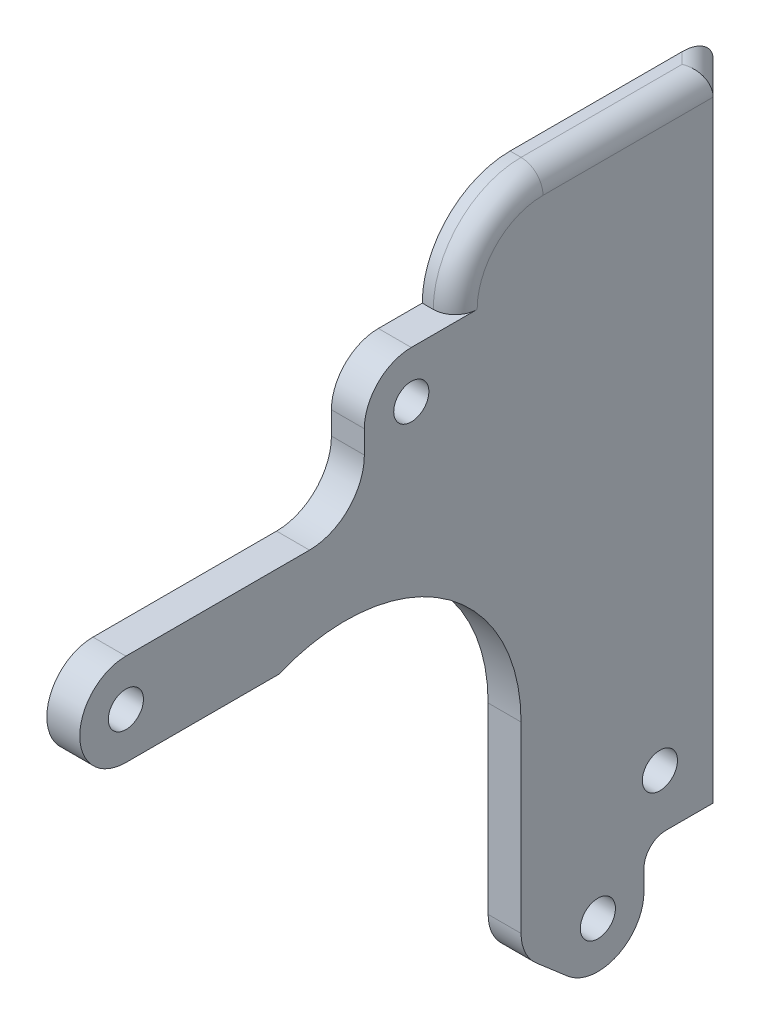
ISO-10303-21;
HEADER;
FILE_DESCRIPTION(('STEP AP214'),'2;1');
FILE_NAME('part.step','',(''),(''),'','','');
FILE_SCHEMA(('AUTOMOTIVE_DESIGN { 1 0 10303 214 1 1 1 1 }'));
ENDSEC;
DATA;
#1=APPLICATION_CONTEXT('core data for automotive mechanical design processes');
#2=APPLICATION_PROTOCOL_DEFINITION('international standard','automotive_design',2000,#1);
#3=PRODUCT_CONTEXT('',#1,'mechanical');
#4=PRODUCT('Part','Part','',(#3));
#5=PRODUCT_RELATED_PRODUCT_CATEGORY('part','',(#4));
#6=PRODUCT_DEFINITION_FORMATION('','',#4);
#7=PRODUCT_DEFINITION_CONTEXT('part definition',#1,'design');
#8=PRODUCT_DEFINITION('design','',#6,#7);
#9=PRODUCT_DEFINITION_SHAPE('','',#8);
#10=(LENGTH_UNIT() NAMED_UNIT(*) SI_UNIT(.MILLI.,.METRE.));
#11=(NAMED_UNIT(*) PLANE_ANGLE_UNIT() SI_UNIT($,.RADIAN.));
#12=(NAMED_UNIT(*) SI_UNIT($,.STERADIAN.) SOLID_ANGLE_UNIT());
#13=UNCERTAINTY_MEASURE_WITH_UNIT(LENGTH_MEASURE(1.E-05),#10,'distance_accuracy_value','');
#14=(GEOMETRIC_REPRESENTATION_CONTEXT(3) GLOBAL_UNCERTAINTY_ASSIGNED_CONTEXT((#13)) GLOBAL_UNIT_ASSIGNED_CONTEXT((#10,
#11,#12)) REPRESENTATION_CONTEXT('',''));
#15=CARTESIAN_POINT('',(0.,0.,0.));
#16=DIRECTION('',(0.,0.,1.));
#17=DIRECTION('',(1.,0.,0.));
#18=AXIS2_PLACEMENT_3D('',#15,#16,#17);
#19=CARTESIAN_POINT('',(556.208774838874,-4.62023270160113,790.681056398549));
#20=DIRECTION('',(1.,0.,0.));
#21=DIRECTION('',(0.,1.,0.));
#22=AXIS2_PLACEMENT_3D('',#19,#20,#21);
#23=PLANE('',#22);
#24=CARTESIAN_POINT('',(556.208774838873,-28.4696825390011,784.171746409659));
#25=DIRECTION('',(1.,0.,0.));
#26=DIRECTION('',(0.,1.,0.));
#27=AXIS2_PLACEMENT_3D('',#24,#25,#26);
#28=CIRCLE('',#27,1.59999999999999);
#29=CARTESIAN_POINT('',(556.208774838873,-26.8696825390011,784.171746409659));
#30=VERTEX_POINT('',#29);
#31=EDGE_CURVE('E446',#30,#30,#28,.T.);
#32=ORIENTED_EDGE('',*,*,#31,.T.);
#33=EDGE_LOOP('',(#32));
#34=FACE_BOUND('',#33,.T.);
#35=CARTESIAN_POINT('',(556.208774838872,-37.3216825390018,789.824746409661));
#36=DIRECTION('',(1.,0.,0.));
#37=DIRECTION('',(0.,1.,0.));
#38=AXIS2_PLACEMENT_3D('',#35,#36,#37);
#39=CIRCLE('',#38,1.59999999999999);
#40=CARTESIAN_POINT('',(556.208774838872,-35.7216825390019,789.824746409661));
#41=VERTEX_POINT('',#40);
#42=EDGE_CURVE('E440',#41,#41,#39,.T.);
#43=ORIENTED_EDGE('',*,*,#42,.T.);
#44=EDGE_LOOP('',(#43));
#45=FACE_BOUND('',#44,.T.);
#46=CARTESIAN_POINT('',(556.208774838874,0.678168045599558,832.822165902112));
#47=DIRECTION('',(1.,0.,0.));
#48=DIRECTION('',(0.,1.,0.));
#49=AXIS2_PLACEMENT_3D('',#46,#47,#48);
#50=CIRCLE('',#49,1.59999999999999);
#51=CARTESIAN_POINT('',(556.208774838874,2.27816804559955,832.822165902112));
#52=VERTEX_POINT('',#51);
#53=EDGE_CURVE('E434',#52,#52,#50,.T.);
#54=ORIENTED_EDGE('',*,*,#53,.T.);
#55=EDGE_LOOP('',(#54));
#56=FACE_BOUND('',#55,.T.);
#57=DIRECTION('',(0.,-0.999999999760611,-2.18810000388693E-05));
#58=VECTOR('',#57,1.);
#59=CARTESIAN_POINT('',(556.208774838875,11.9538614657142,811.097116143249));
#60=LINE('',#59,#58);
#61=CARTESIAN_POINT('',(556.208774838875,11.9539224639993,811.097116144584));
#62=VERTEX_POINT('',#61);
#63=CARTESIAN_POINT('',(556.208774838875,9.87775558153382,811.097070715976));
#64=VERTEX_POINT('',#63);
#65=EDGE_CURVE('E310',#62,#64,#60,.T.);
#66=ORIENTED_EDGE('',*,*,#65,.F.);
#67=CARTESIAN_POINT('',(556.208774838875,11.954016012925,806.821766504544));
#68=DIRECTION('',(1.,0.,0.));
#69=DIRECTION('',(0.,1.,0.));
#70=AXIS2_PLACEMENT_3D('',#67,#68,#69);
#71=CIRCLE('',#70,4.27534964106351);
#72=CARTESIAN_POINT('',(556.208774838875,16.2293656539885,806.821766504544));
#73=VERTEX_POINT('',#72);
#74=EDGE_CURVE('E300',#62,#73,#71,.F.);
#75=ORIENTED_EDGE('',*,*,#74,.T.);
#76=DIRECTION('',(0.,0.,-1.));
#77=VECTOR('',#76,1.);
#78=CARTESIAN_POINT('',(556.208774838875,16.2293656539885,790.681056398549));
#79=LINE('',#78,#77);
#80=CARTESIAN_POINT('',(556.208774838875,16.2293656539885,802.821617988967));
#81=VERTEX_POINT('',#80);
#82=EDGE_CURVE('E247',#73,#81,#79,.T.);
#83=ORIENTED_EDGE('',*,*,#82,.T.);
#84=CARTESIAN_POINT('',(556.208774838875,16.2293656539885,794.821766502747));
#85=DIRECTION('',(-1.,0.,0.));
#86=DIRECTION('',(0.,-1.,0.));
#87=AXIS2_PLACEMENT_3D('',#84,#85,#86);
#88=CIRCLE('',#87,7.99985148622073);
#89=CARTESIAN_POINT('',(556.208774838875,24.2292171380032,794.821766502747));
#90=VERTEX_POINT('',#89);
#91=EDGE_CURVE('E249',#81,#90,#88,.T.);
#92=ORIENTED_EDGE('',*,*,#91,.T.);
#93=DIRECTION('',(0.,0.,1.));
#94=VECTOR('',#93,1.);
#95=CARTESIAN_POINT('',(556.208774838875,24.2292171357972,790.681056398549));
#96=LINE('',#95,#94);
#97=CARTESIAN_POINT('',(556.208774838875,24.2292171357972,779.150173534406));
#98=VERTEX_POINT('',#97);
#99=EDGE_CURVE('E350',#98,#90,#96,.T.);
#100=ORIENTED_EDGE('',*,*,#99,.F.);
#101=CARTESIAN_POINT('',(556.208774838875,22.2292171357972,779.150173534406));
#102=DIRECTION('',(1.,0.,0.));
#103=DIRECTION('',(0.,0.,1.));
#104=AXIS2_PLACEMENT_3D('',#101,#102,#103);
#105=ELLIPSE('',#104,2.82842712474621,2.);
#106=CARTESIAN_POINT('',(556.208774838875,22.2292171357973,776.321746409658));
#107=VERTEX_POINT('',#106);
#108=EDGE_CURVE('E258',#98,#107,#105,.F.);
#109=ORIENTED_EDGE('',*,*,#108,.T.);
#110=DIRECTION('',(0.,1.,0.));
#111=VECTOR('',#110,1.);
#112=CARTESIAN_POINT('',(556.208774838874,-4.62023270160113,776.321746409658));
#113=LINE('',#112,#111);
#114=CARTESIAN_POINT('',(556.208774838873,-31.4696825389997,776.321746409658));
#115=VERTEX_POINT('',#114);
#116=EDGE_CURVE('E356',#115,#107,#113,.T.);
#117=ORIENTED_EDGE('',*,*,#116,.F.);
#118=CARTESIAN_POINT('',(556.208774838872,-31.4696825389997,778.321746409658));
#119=DIRECTION('',(1.,0.,0.));
#120=DIRECTION('',(0.,1.,0.));
#121=AXIS2_PLACEMENT_3D('',#118,#119,#120);
#122=CIRCLE('',#121,2.);
#123=CARTESIAN_POINT('',(556.208774838872,-33.4696825389997,778.321746409658));
#124=VERTEX_POINT('',#123);
#125=EDGE_CURVE('E576',#124,#115,#122,.T.);
#126=ORIENTED_EDGE('',*,*,#125,.F.);
#127=DIRECTION('',(0.,0.,1.));
#128=VECTOR('',#127,1.);
#129=CARTESIAN_POINT('',(556.208774838873,-33.4696825389999,790.681056398549));
#130=LINE('',#129,#128);
#131=CARTESIAN_POINT('',(556.208774838873,-33.4696825389999,783.624746409661));
#132=VERTEX_POINT('',#131);
#133=EDGE_CURVE('E579',#132,#124,#130,.F.);
#134=ORIENTED_EDGE('',*,*,#133,.F.);
#135=CARTESIAN_POINT('',(556.208774838872,-35.469682539,783.624746409661));
#136=DIRECTION('',(1.,0.,0.));
#137=DIRECTION('',(0.,1.,0.));
#138=AXIS2_PLACEMENT_3D('',#135,#136,#137);
#139=CIRCLE('',#138,2.);
#140=CARTESIAN_POINT('',(556.208774838872,-35.4696825390001,785.624746409661));
#141=VERTEX_POINT('',#140);
#142=EDGE_CURVE('E275',#132,#141,#139,.T.);
#143=ORIENTED_EDGE('',*,*,#142,.T.);
#144=DIRECTION('',(0.,1.,0.));
#145=VECTOR('',#144,1.);
#146=CARTESIAN_POINT('',(556.208774838874,-4.62023270160113,785.624746409661));
#147=LINE('',#146,#145);
#148=CARTESIAN_POINT('',(556.208774838872,-37.3216825390004,785.624746409661));
#149=VERTEX_POINT('',#148);
#150=EDGE_CURVE('E385',#149,#141,#147,.T.);
#151=ORIENTED_EDGE('',*,*,#150,.F.);
#152=CARTESIAN_POINT('',(556.208774838872,-37.3216825390004,789.82474640966));
#153=DIRECTION('',(1.,0.,0.));
#154=DIRECTION('',(0.,1.,0.));
#155=AXIS2_PLACEMENT_3D('',#152,#153,#154);
#156=CIRCLE('',#155,4.2);
#157=CARTESIAN_POINT('',(556.208774838872,-40.5025632800322,792.567372470816));
#158=VERTEX_POINT('',#157);
#159=EDGE_CURVE('E383',#158,#149,#156,.T.);
#160=ORIENTED_EDGE('',*,*,#159,.F.);
#161=DIRECTION('',(0.,-0.653006205037219,-0.757352557388492));
#162=VECTOR('',#161,1.);
#163=CARTESIAN_POINT('',(556.208774838872,-38.0310905722792,795.433771229808));
#164=LINE('',#163,#162);
#165=CARTESIAN_POINT('',(556.208774838872,-38.031090572279,795.433771229808));
#166=VERTEX_POINT('',#165);
#167=EDGE_CURVE('E378',#166,#158,#164,.T.);
#168=ORIENTED_EDGE('',*,*,#167,.F.);
#169=CARTESIAN_POINT('',(556.208774838872,-35.0016803427251,792.82174640966));
#170=DIRECTION('',(1.,0.,0.));
#171=DIRECTION('',(0.,1.,0.));
#172=AXIS2_PLACEMENT_3D('',#169,#170,#171);
#173=CIRCLE('',#172,4.);
#174=CARTESIAN_POINT('',(556.208774838872,-35.0016803427253,796.82174640966));
#175=VERTEX_POINT('',#174);
#176=EDGE_CURVE('E290',#166,#175,#173,.F.);
#177=ORIENTED_EDGE('',*,*,#176,.T.);
#178=DIRECTION('',(0.,1.,0.));
#179=VECTOR('',#178,1.);
#180=CARTESIAN_POINT('',(556.208774838874,-4.62023270160113,796.82174640966));
#181=LINE('',#180,#179);
#182=CARTESIAN_POINT('',(556.208774838874,-18.3215800969265,796.82174640966));
#183=VERTEX_POINT('',#182);
#184=EDGE_CURVE('E384',#183,#175,#181,.F.);
#185=ORIENTED_EDGE('',*,*,#184,.F.);
#186=CARTESIAN_POINT('',(556.208774838875,-18.3215800969269,812.82174640966));
#187=DIRECTION('',(1.,0.,0.));
#188=DIRECTION('',(0.,0.,-1.));
#189=AXIS2_PLACEMENT_3D('',#186,#187,#188);
#190=CIRCLE('',#189,16.);
#191=CARTESIAN_POINT('',(556.208774838874,-3.52131008533089,818.900562707579));
#192=VERTEX_POINT('',#191);
#193=EDGE_CURVE('E390',#192,#183,#190,.F.);
#194=ORIENTED_EDGE('',*,*,#193,.F.);
#195=DIRECTION('',(0.,0.,1.));
#196=VECTOR('',#195,1.);
#197=CARTESIAN_POINT('',(556.208774838874,-3.52131008533108,790.681056398549));
#198=LINE('',#197,#196);
#199=CARTESIAN_POINT('',(556.208774838874,-3.52131008533109,832.822687771179));
#200=VERTEX_POINT('',#199);
#201=EDGE_CURVE('E391',#200,#192,#198,.F.);
#202=ORIENTED_EDGE('',*,*,#201,.F.);
#203=CARTESIAN_POINT('',(556.208774838874,0.678168045600863,832.822687771179));
#204=DIRECTION('',(1.,0.,0.));
#205=DIRECTION('',(0.,1.,0.));
#206=AXIS2_PLACEMENT_3D('',#203,#204,#205);
#207=CIRCLE('',#206,4.19947813093198);
#208=CARTESIAN_POINT('',(556.208774838874,4.87764617653326,832.822687771179));
#209=VERTEX_POINT('',#208);
#210=EDGE_CURVE('E252',#209,#200,#207,.T.);
#211=ORIENTED_EDGE('',*,*,#210,.F.);
#212=DIRECTION('',(0.,0.,1.));
#213=VECTOR('',#212,1.);
#214=CARTESIAN_POINT('',(556.208774838874,4.87764617653367,790.681056398549));
#215=LINE('',#214,#213);
#216=CARTESIAN_POINT('',(556.208774838874,4.87764617653367,816.097070714779));
#217=VERTEX_POINT('',#216);
#218=EDGE_CURVE('E411',#217,#209,#215,.T.);
#219=ORIENTED_EDGE('',*,*,#218,.F.);
#220=CARTESIAN_POINT('',(556.208774838875,9.87764617653363,816.097070714779));
#221=DIRECTION('',(1.,0.,0.));
#222=DIRECTION('',(0.,1.,0.));
#223=AXIS2_PLACEMENT_3D('',#220,#221,#222);
#224=CIRCLE('',#223,5.);
#225=EDGE_CURVE('E13',#217,#64,#224,.T.);
#226=ORIENTED_EDGE('',*,*,#225,.T.);
#227=EDGE_LOOP('',(#66,#75,#83,#92,#100,#109,#117,#126,#134,#143,#151,#160,#168,#177,#185,#194,
#202,#211,#219,#226));
#228=FACE_BOUND('',#227,.T.);
#229=CARTESIAN_POINT('',(556.208774838875,11.9539550146398,806.821766503209));
#230=DIRECTION('',(-1.,0.,0.));
#231=DIRECTION('',(0.,0.,1.));
#232=AXIS2_PLACEMENT_3D('',#229,#230,#231);
#233=CIRCLE('',#232,1.59999999999999);
#234=CARTESIAN_POINT('',(556.208774838875,11.9539550146398,808.421766503209));
#235=VERTEX_POINT('',#234);
#236=EDGE_CURVE('E431',#235,#235,#233,.T.);
#237=ORIENTED_EDGE('',*,*,#236,.F.);
#238=EDGE_LOOP('',(#237));
#239=FACE_BOUND('',#238,.T.);
#240=ADVANCED_FACE('F42',(#34,#45,#56,#228,#239),#23,.F.);
#241=CARTESIAN_POINT('',(556.208774838876,24.2292171357971,786.571756456435));
#242=DIRECTION('',(0.,1.,0.));
#243=DIRECTION('',(-1.,0.,0.));
#244=AXIS2_PLACEMENT_3D('',#241,#242,#243);
#245=PLANE('',#244);
#246=DIRECTION('',(0.,0.,1.));
#247=VECTOR('',#246,1.);
#248=CARTESIAN_POINT('',(557.208774838875,24.229217135797,786.571756456435));
#249=LINE('',#248,#247);
#250=CARTESIAN_POINT('',(557.208774838875,24.2292171402092,794.821766502747));
#251=VERTEX_POINT('',#250);
#252=CARTESIAN_POINT('',(557.208774838875,24.2292171357971,780.150173534406));
#253=VERTEX_POINT('',#252);
#254=EDGE_CURVE('E254',#251,#253,#249,.F.);
#255=ORIENTED_EDGE('',*,*,#254,.T.);
#256=DIRECTION('',(0.707106781186541,0.,0.707106781186554));
#257=VECTOR('',#256,1.);
#258=CARTESIAN_POINT('',(559.91956629989,24.2292171357969,782.860964995421));
#259=LINE('',#258,#257);
#260=EDGE_CURVE('E256',#253,#98,#259,.F.);
#261=ORIENTED_EDGE('',*,*,#260,.T.);
#262=ORIENTED_EDGE('',*,*,#99,.T.);
#263=DIRECTION('',(-1.,0.,0.));
#264=VECTOR('',#263,1.);
#265=CARTESIAN_POINT('',(559.208774838879,24.2292171402091,794.821766502747));
#266=LINE('',#265,#264);
#267=EDGE_CURVE('E424',#251,#90,#266,.T.);
#268=ORIENTED_EDGE('',*,*,#267,.F.);
#269=EDGE_LOOP('',(#255,#261,#262,#268));
#270=FACE_BOUND('',#269,.T.);
#271=ADVANCED_FACE('F457',(#270),#245,.T.);
#272=CARTESIAN_POINT('',(559.208774838874,-4.62023270160122,790.681056398549));
#273=DIRECTION('',(1.,0.,0.));
#274=DIRECTION('',(0.,1.,0.));
#275=AXIS2_PLACEMENT_3D('',#272,#273,#274);
#276=PLANE('',#275);
#277=CARTESIAN_POINT('',(559.208774838873,-28.4696825390011,784.171746409659));
#278=DIRECTION('',(1.,0.,0.));
#279=DIRECTION('',(0.,0.,-1.));
#280=AXIS2_PLACEMENT_3D('',#277,#278,#279);
#281=CIRCLE('',#280,1.59999999999999);
#282=CARTESIAN_POINT('',(559.208774838873,-28.4696825390011,782.571746409659));
#283=VERTEX_POINT('',#282);
#284=EDGE_CURVE('E283',#283,#283,#281,.T.);
#285=ORIENTED_EDGE('',*,*,#284,.F.);
#286=EDGE_LOOP('',(#285));
#287=FACE_BOUND('',#286,.T.);
#288=CARTESIAN_POINT('',(559.208774838872,-37.3216825390018,789.824746409661));
#289=DIRECTION('',(1.,0.,0.));
#290=DIRECTION('',(0.,0.,-1.));
#291=AXIS2_PLACEMENT_3D('',#288,#289,#290);
#292=CIRCLE('',#291,1.59999999999999);
#293=CARTESIAN_POINT('',(559.208774838872,-37.3216825390018,788.224746409661));
#294=VERTEX_POINT('',#293);
#295=EDGE_CURVE('E443',#294,#294,#292,.T.);
#296=ORIENTED_EDGE('',*,*,#295,.F.);
#297=EDGE_LOOP('',(#296));
#298=FACE_BOUND('',#297,.T.);
#299=CARTESIAN_POINT('',(559.208774838874,0.678168045599558,832.822165902112));
#300=DIRECTION('',(1.,0.,0.));
#301=DIRECTION('',(0.,0.,-1.));
#302=AXIS2_PLACEMENT_3D('',#299,#300,#301);
#303=CIRCLE('',#302,1.59999999999999);
#304=CARTESIAN_POINT('',(559.208774838874,0.678168045599558,831.222165902112));
#305=VERTEX_POINT('',#304);
#306=EDGE_CURVE('E437',#305,#305,#303,.T.);
#307=ORIENTED_EDGE('',*,*,#306,.F.);
#308=EDGE_LOOP('',(#307));
#309=FACE_BOUND('',#308,.T.);
#310=CARTESIAN_POINT('',(559.208774838875,11.9539550146398,806.821766503209));
#311=DIRECTION('',(1.,0.,0.));
#312=DIRECTION('',(0.,1.,0.));
#313=AXIS2_PLACEMENT_3D('',#310,#311,#312);
#314=CIRCLE('',#313,1.59999999999999);
#315=CARTESIAN_POINT('',(559.208774838875,13.5539550146398,806.821766503209));
#316=VERTEX_POINT('',#315);
#317=EDGE_CURVE('E428',#316,#316,#314,.T.);
#318=ORIENTED_EDGE('',*,*,#317,.F.);
#319=EDGE_LOOP('',(#318));
#320=FACE_BOUND('',#319,.T.);
#321=DIRECTION('',(0.,0.,1.));
#322=VECTOR('',#321,1.);
#323=CARTESIAN_POINT('',(559.208774838879,16.2293656539883,802.821617988967));
#324=LINE('',#323,#322);
#325=CARTESIAN_POINT('',(559.208774838875,16.2293656539883,800.821617988967));
#326=VERTEX_POINT('',#325);
#327=CARTESIAN_POINT('',(559.208774838879,16.2293656539883,806.821766504544));
#328=VERTEX_POINT('',#327);
#329=EDGE_CURVE('E426',#326,#328,#324,.T.);
#330=ORIENTED_EDGE('',*,*,#329,.T.);
#331=CARTESIAN_POINT('',(559.208774838875,11.9540160129248,806.821766504544));
#332=DIRECTION('',(1.,0.,0.));
#333=DIRECTION('',(0.,1.,0.));
#334=AXIS2_PLACEMENT_3D('',#331,#332,#333);
#335=CIRCLE('',#334,4.27534964106351);
#336=CARTESIAN_POINT('',(559.208774838875,11.9539224639992,811.097116144584));
#337=VERTEX_POINT('',#336);
#338=EDGE_CURVE('E295',#328,#337,#335,.T.);
#339=ORIENTED_EDGE('',*,*,#338,.T.);
#340=DIRECTION('',(0.,-0.999999999760611,-2.18810000389889E-05));
#341=VECTOR('',#340,1.);
#342=CARTESIAN_POINT('',(559.208774838875,9.66430852362397,811.097066045541));
#343=LINE('',#342,#341);
#344=CARTESIAN_POINT('',(559.208774838875,9.87775558153367,811.097070715976));
#345=VERTEX_POINT('',#344);
#346=EDGE_CURVE('E216',#345,#337,#343,.F.);
#347=ORIENTED_EDGE('',*,*,#346,.F.);
#348=CARTESIAN_POINT('',(559.208774838875,9.87764617653348,816.097070714779));
#349=DIRECTION('',(1.,0.,0.));
#350=DIRECTION('',(0.,1.,0.));
#351=AXIS2_PLACEMENT_3D('',#348,#349,#350);
#352=CIRCLE('',#351,5.);
#353=CARTESIAN_POINT('',(559.208774838874,4.87764617653347,816.097070714779));
#354=VERTEX_POINT('',#353);
#355=EDGE_CURVE('E50',#345,#354,#352,.F.);
#356=ORIENTED_EDGE('',*,*,#355,.T.);
#357=DIRECTION('',(0.,0.,1.));
#358=VECTOR('',#357,1.);
#359=CARTESIAN_POINT('',(559.208774838874,4.87764617653312,823.847694654616));
#360=LINE('',#359,#358);
#361=CARTESIAN_POINT('',(559.208774838874,4.8776461765327,832.822687771179));
#362=VERTEX_POINT('',#361);
#363=EDGE_CURVE('E315',#362,#354,#360,.F.);
#364=ORIENTED_EDGE('',*,*,#363,.F.);
#365=CARTESIAN_POINT('',(559.208774838874,0.678168045600724,832.822687771179));
#366=DIRECTION('',(1.,0.,0.));
#367=DIRECTION('',(0.,1.,0.));
#368=AXIS2_PLACEMENT_3D('',#365,#366,#367);
#369=CIRCLE('',#368,4.19947813093198);
#370=CARTESIAN_POINT('',(559.208774838874,-3.52131008533126,832.822687771179));
#371=VERTEX_POINT('',#370);
#372=EDGE_CURVE('E234',#371,#362,#369,.F.);
#373=ORIENTED_EDGE('',*,*,#372,.F.);
#374=DIRECTION('',(0.,0.,1.));
#375=VECTOR('',#374,1.);
#376=CARTESIAN_POINT('',(559.208774838874,-3.52131008533094,825.641995859321));
#377=LINE('',#376,#375);
#378=CARTESIAN_POINT('',(559.208774838874,-3.52131008533047,818.900562707579));
#379=VERTEX_POINT('',#378);
#380=EDGE_CURVE('E330',#379,#371,#377,.T.);
#381=ORIENTED_EDGE('',*,*,#380,.F.);
#382=CARTESIAN_POINT('',(559.208774838875,-18.3215800969269,812.82174640966));
#383=DIRECTION('',(1.,0.,0.));
#384=DIRECTION('',(0.,0.,-1.));
#385=AXIS2_PLACEMENT_3D('',#382,#383,#384);
#386=CIRCLE('',#385,16.);
#387=CARTESIAN_POINT('',(559.208774838874,-18.3215800969262,796.82174640966));
#388=VERTEX_POINT('',#387);
#389=EDGE_CURVE('E241',#379,#388,#386,.F.);
#390=ORIENTED_EDGE('',*,*,#389,.T.);
#391=DIRECTION('',(0.,-1.,0.));
#392=VECTOR('',#391,1.);
#393=CARTESIAN_POINT('',(559.208774838872,-27.5779638126226,796.82174640966));
#394=LINE('',#393,#392);
#395=CARTESIAN_POINT('',(559.208774838872,-35.0016803427255,796.82174640966));
#396=VERTEX_POINT('',#395);
#397=EDGE_CURVE('E245',#396,#388,#394,.F.);
#398=ORIENTED_EDGE('',*,*,#397,.F.);
#399=CARTESIAN_POINT('',(559.208774838872,-35.0016803427253,792.82174640966));
#400=DIRECTION('',(1.,0.,0.));
#401=DIRECTION('',(0.,1.,0.));
#402=AXIS2_PLACEMENT_3D('',#399,#400,#401);
#403=CIRCLE('',#402,4.);
#404=CARTESIAN_POINT('',(559.208774838872,-38.0310905722794,795.433771229808));
#405=VERTEX_POINT('',#404);
#406=EDGE_CURVE('E286',#396,#405,#403,.T.);
#407=ORIENTED_EDGE('',*,*,#406,.T.);
#408=DIRECTION('',(0.,-0.653006205037193,-0.757352557388515));
#409=VECTOR('',#408,1.);
#410=CARTESIAN_POINT('',(559.208774838872,-22.0551379877316,813.962582217042));
#411=LINE('',#410,#409);
#412=CARTESIAN_POINT('',(559.208774838872,-40.5025632800325,792.567372470816));
#413=VERTEX_POINT('',#412);
#414=EDGE_CURVE('E597',#413,#405,#411,.F.);
#415=ORIENTED_EDGE('',*,*,#414,.F.);
#416=CARTESIAN_POINT('',(559.208774838872,-37.3216825390006,789.82474640966));
#417=DIRECTION('',(1.,0.,0.));
#418=DIRECTION('',(0.,1.,0.));
#419=AXIS2_PLACEMENT_3D('',#416,#417,#418);
#420=CIRCLE('',#419,4.2);
#421=CARTESIAN_POINT('',(559.208774838872,-37.3216825390004,785.624746409661));
#422=VERTEX_POINT('',#421);
#423=EDGE_CURVE('E236',#422,#413,#420,.F.);
#424=ORIENTED_EDGE('',*,*,#423,.F.);
#425=DIRECTION('',(0.,1.,0.));
#426=VECTOR('',#425,1.);
#427=CARTESIAN_POINT('',(559.208774838872,-35.6966818971852,785.624746409661));
#428=LINE('',#427,#426);
#429=CARTESIAN_POINT('',(559.208774838872,-35.4696825390003,785.624746409661));
#430=VERTEX_POINT('',#429);
#431=EDGE_CURVE('E239',#430,#422,#428,.F.);
#432=ORIENTED_EDGE('',*,*,#431,.F.);
#433=CARTESIAN_POINT('',(559.208774838872,-35.4696825390002,783.624746409661));
#434=DIRECTION('',(1.,0.,0.));
#435=DIRECTION('',(0.,1.,0.));
#436=AXIS2_PLACEMENT_3D('',#433,#434,#435);
#437=CIRCLE('',#436,2.);
#438=CARTESIAN_POINT('',(559.208774838873,-33.4696825390002,783.624746409661));
#439=VERTEX_POINT('',#438);
#440=EDGE_CURVE('E201',#430,#439,#437,.F.);
#441=ORIENTED_EDGE('',*,*,#440,.T.);
#442=DIRECTION('',(0.,0.,1.));
#443=VECTOR('',#442,1.);
#444=CARTESIAN_POINT('',(559.208774838873,-33.4696825390001,780.721746409659));
#445=LINE('',#444,#443);
#446=CARTESIAN_POINT('',(559.208774838874,-33.469682539,779.32174640966));
#447=VERTEX_POINT('',#446);
#448=EDGE_CURVE('E197',#447,#439,#445,.T.);
#449=ORIENTED_EDGE('',*,*,#448,.F.);
#450=DIRECTION('',(0.,1.,0.));
#451=VECTOR('',#450,1.);
#452=CARTESIAN_POINT('',(559.208774838875,-4.62023270160096,779.32174640966));
#453=LINE('',#452,#451);
#454=CARTESIAN_POINT('',(559.208774838875,22.229217135797,779.32174640966));
#455=VERTEX_POINT('',#454);
#456=EDGE_CURVE('E184',#455,#447,#453,.F.);
#457=ORIENTED_EDGE('',*,*,#456,.F.);
#458=DIRECTION('',(0.,0.,1.));
#459=VECTOR('',#458,1.);
#460=CARTESIAN_POINT('',(559.208774838875,22.2292171357969,790.681056398549));
#461=LINE('',#460,#459);
#462=CARTESIAN_POINT('',(559.208774838875,22.2292171357969,794.821766502747));
#463=VERTEX_POINT('',#462);
#464=EDGE_CURVE('E260',#455,#463,#461,.T.);
#465=ORIENTED_EDGE('',*,*,#464,.T.);
#466=CARTESIAN_POINT('',(559.208774838875,16.2293656539883,794.821766502747));
#467=DIRECTION('',(1.,0.,0.));
#468=DIRECTION('',(0.,1.,0.));
#469=AXIS2_PLACEMENT_3D('',#466,#467,#468);
#470=CIRCLE('',#469,5.99985148622073);
#471=EDGE_CURVE('E262',#463,#326,#470,.T.);
#472=ORIENTED_EDGE('',*,*,#471,.T.);
#473=EDGE_LOOP('',(#330,#339,#347,#356,#364,#373,#381,#390,#398,#407,#415,#424,#432,#441,#449,
#457,#465,#472));
#474=FACE_BOUND('',#473,.T.);
#475=ADVANCED_FACE('F199',(#287,#298,#309,#320,#474),#276,.T.);
#476=CARTESIAN_POINT('',(559.208774838874,-3.52131008533094,825.641995859321));
#477=DIRECTION('',(0.,-1.,0.));
#478=DIRECTION('',(1.,0.,0.));
#479=AXIS2_PLACEMENT_3D('',#476,#477,#478);
#480=PLANE('',#479);
#481=DIRECTION('',(1.,0.,0.));
#482=VECTOR('',#481,1.);
#483=CARTESIAN_POINT('',(559.208774838873,-3.52131008533031,818.900562707578));
#484=LINE('',#483,#482);
#485=EDGE_CURVE('E246',#192,#379,#484,.T.);
#486=ORIENTED_EDGE('',*,*,#485,.T.);
#487=ORIENTED_EDGE('',*,*,#380,.T.);
#488=DIRECTION('',(1.,0.,0.));
#489=VECTOR('',#488,1.);
#490=CARTESIAN_POINT('',(556.208774838874,-3.52131008533112,832.822687771179));
#491=LINE('',#490,#489);
#492=EDGE_CURVE('E220',#200,#371,#491,.T.);
#493=ORIENTED_EDGE('',*,*,#492,.F.);
#494=ORIENTED_EDGE('',*,*,#201,.T.);
#495=EDGE_LOOP('',(#486,#487,#493,#494));
#496=FACE_BOUND('',#495,.T.);
#497=ADVANCED_FACE('F456',(#496),#480,.T.);
#498=CARTESIAN_POINT('',(559.208774838873,-18.3215800969269,812.82174640966));
#499=DIRECTION('',(1.,0.,0.));
#500=DIRECTION('',(0.,0.,-1.));
#501=AXIS2_PLACEMENT_3D('',#498,#499,#500);
#502=CYLINDRICAL_SURFACE('',#501,16.);
#503=ORIENTED_EDGE('',*,*,#193,.T.);
#504=DIRECTION('',(1.,0.,0.));
#505=VECTOR('',#504,1.);
#506=CARTESIAN_POINT('',(559.208774838873,-18.3215800969262,796.82174640966));
#507=LINE('',#506,#505);
#508=EDGE_CURVE('E339',#388,#183,#507,.F.);
#509=ORIENTED_EDGE('',*,*,#508,.F.);
#510=ORIENTED_EDGE('',*,*,#389,.F.);
#511=ORIENTED_EDGE('',*,*,#485,.F.);
#512=EDGE_LOOP('',(#503,#509,#510,#511));
#513=FACE_BOUND('',#512,.T.);
#514=ADVANCED_FACE('F521',(#513),#502,.F.);
#515=CARTESIAN_POINT('',(559.208774838873,-27.5779638126226,796.82174640966));
#516=DIRECTION('',(0.,0.,1.));
#517=DIRECTION('',(0.,-1.,0.));
#518=AXIS2_PLACEMENT_3D('',#515,#516,#517);
#519=PLANE('',#518);
#520=ORIENTED_EDGE('',*,*,#184,.T.);
#521=DIRECTION('',(1.,0.,0.));
#522=VECTOR('',#521,1.);
#523=CARTESIAN_POINT('',(559.208774838873,-35.0016803427255,796.82174640966));
#524=LINE('',#523,#522);
#525=EDGE_CURVE('E277',#175,#396,#524,.T.);
#526=ORIENTED_EDGE('',*,*,#525,.T.);
#527=ORIENTED_EDGE('',*,*,#397,.T.);
#528=ORIENTED_EDGE('',*,*,#508,.T.);
#529=EDGE_LOOP('',(#520,#526,#527,#528));
#530=FACE_BOUND('',#529,.T.);
#531=ADVANCED_FACE('F517',(#530),#519,.T.);
#532=CARTESIAN_POINT('',(556.208774838873,-22.0551379877315,813.962582217042));
#533=DIRECTION('',(0.,-0.757352557388515,0.653006205037193));
#534=DIRECTION('',(0.,-0.653006205037193,-0.757352557388515));
#535=AXIS2_PLACEMENT_3D('',#532,#533,#534);
#536=PLANE('',#535);
#537=ORIENTED_EDGE('',*,*,#414,.T.);
#538=DIRECTION('',(1.,0.,0.));
#539=VECTOR('',#538,1.);
#540=CARTESIAN_POINT('',(556.208774838872,-38.0310905722792,795.433771229808));
#541=LINE('',#540,#539);
#542=EDGE_CURVE('E288',#405,#166,#541,.F.);
#543=ORIENTED_EDGE('',*,*,#542,.T.);
#544=ORIENTED_EDGE('',*,*,#167,.T.);
#545=DIRECTION('',(1.,0.,0.));
#546=VECTOR('',#545,1.);
#547=CARTESIAN_POINT('',(556.208774838872,-40.5025632800324,792.567372470816));
#548=LINE('',#547,#546);
#549=EDGE_CURVE('E240',#413,#158,#548,.F.);
#550=ORIENTED_EDGE('',*,*,#549,.F.);
#551=EDGE_LOOP('',(#537,#543,#544,#550));
#552=FACE_BOUND('',#551,.T.);
#553=ADVANCED_FACE('F513',(#552),#536,.T.);
#554=CARTESIAN_POINT('',(556.208774838872,-37.3216825390004,789.82474640966));
#555=DIRECTION('',(1.,0.,0.));
#556=DIRECTION('',(0.,1.,0.));
#557=AXIS2_PLACEMENT_3D('',#554,#555,#556);
#558=CYLINDRICAL_SURFACE('',#557,4.2);
#559=DIRECTION('',(1.,0.,0.));
#560=VECTOR('',#559,1.);
#561=CARTESIAN_POINT('',(556.208774838872,-37.3216825390004,785.624746409661));
#562=LINE('',#561,#560);
#563=EDGE_CURVE('E205',#422,#149,#562,.F.);
#564=ORIENTED_EDGE('',*,*,#563,.F.);
#565=ORIENTED_EDGE('',*,*,#423,.T.);
#566=ORIENTED_EDGE('',*,*,#549,.T.);
#567=ORIENTED_EDGE('',*,*,#159,.T.);
#568=EDGE_LOOP('',(#564,#565,#566,#567));
#569=FACE_BOUND('',#568,.T.);
#570=ADVANCED_FACE('F509',(#569),#558,.T.);
#571=CARTESIAN_POINT('',(556.208774838872,-35.6966818971852,785.624746409661));
#572=DIRECTION('',(0.,0.,-1.));
#573=DIRECTION('',(0.,1.,0.));
#574=AXIS2_PLACEMENT_3D('',#571,#572,#573);
#575=PLANE('',#574);
#576=ORIENTED_EDGE('',*,*,#150,.T.);
#577=DIRECTION('',(1.,0.,0.));
#578=VECTOR('',#577,1.);
#579=CARTESIAN_POINT('',(559.208774838872,-35.4696825390003,785.624746409661));
#580=LINE('',#579,#578);
#581=EDGE_CURVE('E267',#141,#430,#580,.T.);
#582=ORIENTED_EDGE('',*,*,#581,.T.);
#583=ORIENTED_EDGE('',*,*,#431,.T.);
#584=ORIENTED_EDGE('',*,*,#563,.T.);
#585=EDGE_LOOP('',(#576,#582,#583,#584));
#586=FACE_BOUND('',#585,.T.);
#587=ADVANCED_FACE('F506',(#586),#575,.T.);
#588=CARTESIAN_POINT('',(556.208774838872,-33.4696825389999,780.721746409659));
#589=DIRECTION('',(0.,-1.,0.));
#590=DIRECTION('',(1.,0.,0.));
#591=AXIS2_PLACEMENT_3D('',#588,#589,#590);
#592=PLANE('',#591);
#593=ORIENTED_EDGE('',*,*,#448,.T.);
#594=DIRECTION('',(1.,0.,0.));
#595=VECTOR('',#594,1.);
#596=CARTESIAN_POINT('',(556.208774838873,-33.469682539,783.624746409661));
#597=LINE('',#596,#595);
#598=EDGE_CURVE('E270',#439,#132,#597,.F.);
#599=ORIENTED_EDGE('',*,*,#598,.T.);
#600=ORIENTED_EDGE('',*,*,#133,.T.);
#601=DIRECTION('',(1.,0.,0.));
#602=VECTOR('',#601,1.);
#603=CARTESIAN_POINT('',(556.208774838872,-33.4696825389997,778.321746409658));
#604=LINE('',#603,#602);
#605=CARTESIAN_POINT('',(558.208774838873,-33.4696825389999,778.321746409658));
#606=VERTEX_POINT('',#605);
#607=EDGE_CURVE('E194',#606,#124,#604,.F.);
#608=ORIENTED_EDGE('',*,*,#607,.F.);
#609=DIRECTION('',(-0.707106781186541,0.,-0.707106781186554));
#610=VECTOR('',#609,1.);
#611=CARTESIAN_POINT('',(557.708774838874,-33.469682539,777.821746409659));
#612=LINE('',#611,#610);
#613=EDGE_CURVE('E189',#447,#606,#612,.T.);
#614=ORIENTED_EDGE('',*,*,#613,.F.);
#615=EDGE_LOOP('',(#593,#599,#600,#608,#614));
#616=FACE_BOUND('',#615,.T.);
#617=ADVANCED_FACE('F207',(#616),#592,.T.);
#618=CARTESIAN_POINT('',(556.208774838872,-31.4696825389997,778.321746409658));
#619=DIRECTION('',(1.,0.,0.));
#620=DIRECTION('',(0.,1.,0.));
#621=AXIS2_PLACEMENT_3D('',#618,#619,#620);
#622=CYLINDRICAL_SURFACE('',#621,2.);
#623=ORIENTED_EDGE('',*,*,#607,.T.);
#624=ORIENTED_EDGE('',*,*,#125,.T.);
#625=CARTESIAN_POINT('',(558.208774838873,-31.4696825389998,778.321746409658));
#626=DIRECTION('',(0.707106781186554,0.,-0.707106781186541));
#627=DIRECTION('',(0.707106781186541,0.,0.707106781186554));
#628=AXIS2_PLACEMENT_3D('',#625,#626,#627);
#629=ELLIPSE('',#628,2.82842712474617,2.);
#630=EDGE_CURVE('E211',#606,#115,#629,.T.);
#631=ORIENTED_EDGE('',*,*,#630,.F.);
#632=EDGE_LOOP('',(#623,#624,#631));
#633=FACE_BOUND('',#632,.T.);
#634=ADVANCED_FACE('F500',(#633),#622,.T.);
#635=CARTESIAN_POINT('',(557.708774838874,-4.62023270160096,777.821746409659));
#636=DIRECTION('',(0.707106781186554,0.,-0.707106781186541));
#637=DIRECTION('',(-0.707106781186541,0.,-0.707106781186554));
#638=AXIS2_PLACEMENT_3D('',#635,#636,#637);
#639=PLANE('',#638);
#640=ORIENTED_EDGE('',*,*,#116,.T.);
#641=DIRECTION('',(0.707106781186541,0.,0.707106781186554));
#642=VECTOR('',#641,1.);
#643=CARTESIAN_POINT('',(557.708774838875,22.2292171357972,777.82174640966));
#644=LINE('',#643,#642);
#645=EDGE_CURVE('E192',#107,#455,#644,.T.);
#646=ORIENTED_EDGE('',*,*,#645,.T.);
#647=ORIENTED_EDGE('',*,*,#456,.T.);
#648=ORIENTED_EDGE('',*,*,#613,.T.);
#649=ORIENTED_EDGE('',*,*,#630,.T.);
#650=EDGE_LOOP('',(#640,#646,#647,#648,#649));
#651=FACE_BOUND('',#650,.T.);
#652=ADVANCED_FACE('F187',(#651),#639,.T.);
#653=CARTESIAN_POINT('',(556.208774838874,9.66430852362397,811.097066045541));
#654=DIRECTION('',(0.,-2.18810000389889E-05,0.999999999760611));
#655=DIRECTION('',(0.,-0.999999999760611,-2.18810000389889E-05));
#656=AXIS2_PLACEMENT_3D('',#653,#654,#655);
#657=PLANE('',#656);
#658=ORIENTED_EDGE('',*,*,#65,.T.);
#659=DIRECTION('',(1.,0.,0.));
#660=VECTOR('',#659,1.);
#661=CARTESIAN_POINT('',(559.208774838875,9.87775558153367,811.097070715976));
#662=LINE('',#661,#660);
#663=EDGE_CURVE('E302',#64,#345,#662,.T.);
#664=ORIENTED_EDGE('',*,*,#663,.T.);
#665=ORIENTED_EDGE('',*,*,#346,.T.);
#666=DIRECTION('',(1.,0.,0.));
#667=VECTOR('',#666,1.);
#668=CARTESIAN_POINT('',(556.208774838875,11.9539224639993,811.097116144584));
#669=LINE('',#668,#667);
#670=EDGE_CURVE('E298',#337,#62,#669,.F.);
#671=ORIENTED_EDGE('',*,*,#670,.T.);
#672=EDGE_LOOP('',(#658,#664,#665,#671));
#673=FACE_BOUND('',#672,.T.);
#674=ADVANCED_FACE('F308',(#673),#657,.T.);
#675=CARTESIAN_POINT('',(556.208774838874,4.87764617653327,823.847694654616));
#676=DIRECTION('',(0.,1.,0.));
#677=DIRECTION('',(-1.,0.,0.));
#678=AXIS2_PLACEMENT_3D('',#675,#676,#677);
#679=PLANE('',#678);
#680=ORIENTED_EDGE('',*,*,#363,.T.);
#681=DIRECTION('',(1.,0.,0.));
#682=VECTOR('',#681,1.);
#683=CARTESIAN_POINT('',(556.208774838874,4.87764617653363,816.097070714779));
#684=LINE('',#683,#682);
#685=EDGE_CURVE('E57',#354,#217,#684,.F.);
#686=ORIENTED_EDGE('',*,*,#685,.T.);
#687=ORIENTED_EDGE('',*,*,#218,.T.);
#688=DIRECTION('',(1.,0.,0.));
#689=VECTOR('',#688,1.);
#690=CARTESIAN_POINT('',(556.208774838874,4.87764617653284,832.822687771179));
#691=LINE('',#690,#689);
#692=EDGE_CURVE('E394',#362,#209,#691,.F.);
#693=ORIENTED_EDGE('',*,*,#692,.F.);
#694=EDGE_LOOP('',(#680,#686,#687,#693));
#695=FACE_BOUND('',#694,.T.);
#696=ADVANCED_FACE('F410',(#695),#679,.T.);
#697=CARTESIAN_POINT('',(556.208774838874,0.678168045600863,832.822687771179));
#698=DIRECTION('',(1.,0.,0.));
#699=DIRECTION('',(0.,1.,0.));
#700=AXIS2_PLACEMENT_3D('',#697,#698,#699);
#701=CYLINDRICAL_SURFACE('',#700,4.19947813093198);
#702=ORIENTED_EDGE('',*,*,#210,.T.);
#703=ORIENTED_EDGE('',*,*,#492,.T.);
#704=ORIENTED_EDGE('',*,*,#372,.T.);
#705=ORIENTED_EDGE('',*,*,#692,.T.);
#706=EDGE_LOOP('',(#702,#703,#704,#705));
#707=FACE_BOUND('',#706,.T.);
#708=ADVANCED_FACE('F407',(#707),#701,.T.);
#709=CARTESIAN_POINT('',(559.208774838879,16.2293656539883,794.821766502747));
#710=DIRECTION('',(-1.,0.,0.));
#711=DIRECTION('',(0.,-1.,0.));
#712=AXIS2_PLACEMENT_3D('',#709,#710,#711);
#713=CYLINDRICAL_SURFACE('',#712,7.99985148622073);
#714=DIRECTION('',(-1.,0.,0.));
#715=VECTOR('',#714,1.);
#716=CARTESIAN_POINT('',(559.208774838879,16.2293656539883,802.821617988967));
#717=LINE('',#716,#715);
#718=CARTESIAN_POINT('',(557.208774838875,16.2293656539884,802.821617988967));
#719=VERTEX_POINT('',#718);
#720=EDGE_CURVE('E334',#719,#81,#717,.T.);
#721=ORIENTED_EDGE('',*,*,#720,.F.);
#722=CARTESIAN_POINT('',(557.208774838875,16.2293656539884,794.821766502747));
#723=DIRECTION('',(1.,0.,0.));
#724=DIRECTION('',(0.,1.,0.));
#725=AXIS2_PLACEMENT_3D('',#722,#723,#724);
#726=CIRCLE('',#725,7.99985148622073);
#727=EDGE_CURVE('E265',#719,#251,#726,.F.);
#728=ORIENTED_EDGE('',*,*,#727,.T.);
#729=ORIENTED_EDGE('',*,*,#267,.T.);
#730=ORIENTED_EDGE('',*,*,#91,.F.);
#731=EDGE_LOOP('',(#721,#728,#729,#730));
#732=FACE_BOUND('',#731,.T.);
#733=ADVANCED_FACE('F459',(#732),#713,.T.);
#734=CARTESIAN_POINT('',(559.208774838879,16.2293656539883,811.097209695556));
#735=DIRECTION('',(0.,-1.,0.));
#736=DIRECTION('',(1.,0.,0.));
#737=AXIS2_PLACEMENT_3D('',#734,#735,#736);
#738=PLANE('',#737);
#739=ORIENTED_EDGE('',*,*,#82,.F.);
#740=DIRECTION('',(1.,0.,0.));
#741=VECTOR('',#740,1.);
#742=CARTESIAN_POINT('',(559.208774838879,16.2293656539883,806.821766504544));
#743=LINE('',#742,#741);
#744=EDGE_CURVE('E292',#73,#328,#743,.T.);
#745=ORIENTED_EDGE('',*,*,#744,.T.);
#746=ORIENTED_EDGE('',*,*,#329,.F.);
#747=CARTESIAN_POINT('',(557.208774838875,16.2293656539884,800.821617988967));
#748=DIRECTION('',(0.,-1.,0.));
#749=DIRECTION('',(1.,0.,0.));
#750=AXIS2_PLACEMENT_3D('',#747,#748,#749);
#751=CIRCLE('',#750,2.);
#752=EDGE_CURVE('E272',#326,#719,#751,.T.);
#753=ORIENTED_EDGE('',*,*,#752,.T.);
#754=ORIENTED_EDGE('',*,*,#720,.T.);
#755=EDGE_LOOP('',(#739,#745,#746,#753,#754));
#756=FACE_BOUND('',#755,.T.);
#757=ADVANCED_FACE('F469',(#756),#738,.F.);
#758=CARTESIAN_POINT('',(556.208774838875,11.9539550146398,806.821766503209));
#759=DIRECTION('',(-1.,0.,0.));
#760=DIRECTION('',(0.,0.,1.));
#761=AXIS2_PLACEMENT_3D('',#758,#759,#760);
#762=CYLINDRICAL_SURFACE('',#761,1.59999999999999);
#763=ORIENTED_EDGE('',*,*,#236,.T.);
#764=EDGE_LOOP('',(#763));
#765=FACE_BOUND('',#764,.T.);
#766=ORIENTED_EDGE('',*,*,#317,.T.);
#767=EDGE_LOOP('',(#766));
#768=FACE_BOUND('',#767,.T.);
#769=ADVANCED_FACE('F466',(#765,#768),#762,.F.);
#770=CARTESIAN_POINT('',(559.208774838874,0.678168045599558,832.822165902112));
#771=DIRECTION('',(1.,0.,0.));
#772=DIRECTION('',(0.,0.,-1.));
#773=AXIS2_PLACEMENT_3D('',#770,#771,#772);
#774=CYLINDRICAL_SURFACE('',#773,1.59999999999999);
#775=ORIENTED_EDGE('',*,*,#53,.F.);
#776=EDGE_LOOP('',(#775));
#777=FACE_BOUND('',#776,.T.);
#778=ORIENTED_EDGE('',*,*,#306,.T.);
#779=EDGE_LOOP('',(#778));
#780=FACE_BOUND('',#779,.T.);
#781=ADVANCED_FACE('F468',(#777,#780),#774,.F.);
#782=CARTESIAN_POINT('',(559.208774838872,-37.3216825390018,789.824746409661));
#783=DIRECTION('',(1.,0.,0.));
#784=DIRECTION('',(0.,0.,-1.));
#785=AXIS2_PLACEMENT_3D('',#782,#783,#784);
#786=CYLINDRICAL_SURFACE('',#785,1.59999999999999);
#787=ORIENTED_EDGE('',*,*,#42,.F.);
#788=EDGE_LOOP('',(#787));
#789=FACE_BOUND('',#788,.T.);
#790=ORIENTED_EDGE('',*,*,#295,.T.);
#791=EDGE_LOOP('',(#790));
#792=FACE_BOUND('',#791,.T.);
#793=ADVANCED_FACE('F476',(#789,#792),#786,.F.);
#794=CARTESIAN_POINT('',(559.208774838873,-28.4696825390011,784.171746409659));
#795=DIRECTION('',(1.,0.,0.));
#796=DIRECTION('',(0.,0.,-1.));
#797=AXIS2_PLACEMENT_3D('',#794,#795,#796);
#798=CYLINDRICAL_SURFACE('',#797,1.59999999999999);
#799=ORIENTED_EDGE('',*,*,#31,.F.);
#800=EDGE_LOOP('',(#799));
#801=FACE_BOUND('',#800,.T.);
#802=ORIENTED_EDGE('',*,*,#284,.T.);
#803=EDGE_LOOP('',(#802));
#804=FACE_BOUND('',#803,.T.);
#805=ADVANCED_FACE('F452',(#801,#804),#798,.F.);
#806=CARTESIAN_POINT('',(557.208774838875,16.2293656539884,794.821766502747));
#807=DIRECTION('',(1.,0.,0.));
#808=DIRECTION('',(0.,1.,0.));
#809=AXIS2_PLACEMENT_3D('',#806,#807,#808);
#810=TOROIDAL_SURFACE('',#809,5.99985148622073,2.);
#811=ORIENTED_EDGE('',*,*,#752,.F.);
#812=ORIENTED_EDGE('',*,*,#471,.F.);
#813=CARTESIAN_POINT('',(557.208774838875,22.2292171402092,794.821766502747));
#814=DIRECTION('',(0.,0.,-1.));
#815=DIRECTION('',(-1.,0.,0.));
#816=AXIS2_PLACEMENT_3D('',#813,#814,#815);
#817=CIRCLE('',#816,2.);
#818=EDGE_CURVE('E280',#251,#463,#817,.T.);
#819=ORIENTED_EDGE('',*,*,#818,.F.);
#820=ORIENTED_EDGE('',*,*,#727,.F.);
#821=EDGE_LOOP('',(#811,#812,#819,#820));
#822=FACE_BOUND('',#821,.T.);
#823=ADVANCED_FACE('F537',(#822),#810,.T.);
#824=CARTESIAN_POINT('',(557.208774838875,22.229217135797,790.681056398549));
#825=DIRECTION('',(0.,0.,1.));
#826=DIRECTION('',(0.,-1.,0.));
#827=AXIS2_PLACEMENT_3D('',#824,#825,#826);
#828=CYLINDRICAL_SURFACE('',#827,2.);
#829=ORIENTED_EDGE('',*,*,#818,.T.);
#830=ORIENTED_EDGE('',*,*,#464,.F.);
#831=CARTESIAN_POINT('',(557.208774838875,22.2292171357971,780.150173534406));
#832=DIRECTION('',(0.382683432365084,0.,0.923879532511289));
#833=DIRECTION('',(-0.923879532511289,0.,0.382683432365084));
#834=AXIS2_PLACEMENT_3D('',#831,#832,#833);
#835=ELLIPSE('',#834,2.16478440058479,2.);
#836=EDGE_CURVE('E278',#253,#455,#835,.F.);
#837=ORIENTED_EDGE('',*,*,#836,.F.);
#838=ORIENTED_EDGE('',*,*,#254,.F.);
#839=EDGE_LOOP('',(#829,#830,#837,#838));
#840=FACE_BOUND('',#839,.T.);
#841=ADVANCED_FACE('F533',(#840),#828,.T.);
#842=CARTESIAN_POINT('',(556.294561276502,22.2292171357972,779.235959972033));
#843=DIRECTION('',(0.707106781186541,0.,0.707106781186554));
#844=DIRECTION('',(0.707106781186554,0.,-0.707106781186541));
#845=AXIS2_PLACEMENT_3D('',#842,#843,#844);
#846=CYLINDRICAL_SURFACE('',#845,2.);
#847=ORIENTED_EDGE('',*,*,#108,.F.);
#848=ORIENTED_EDGE('',*,*,#260,.F.);
#849=ORIENTED_EDGE('',*,*,#836,.T.);
#850=ORIENTED_EDGE('',*,*,#645,.F.);
#851=EDGE_LOOP('',(#847,#848,#849,#850));
#852=FACE_BOUND('',#851,.T.);
#853=ADVANCED_FACE('F529',(#852),#846,.T.);
#854=CARTESIAN_POINT('',(556.208774838872,-35.469682539,783.624746409661));
#855=DIRECTION('',(-1.,0.,0.));
#856=DIRECTION('',(0.,-1.,0.));
#857=AXIS2_PLACEMENT_3D('',#854,#855,#856);
#858=CYLINDRICAL_SURFACE('',#857,2.);
#859=ORIENTED_EDGE('',*,*,#142,.F.);
#860=ORIENTED_EDGE('',*,*,#598,.F.);
#861=ORIENTED_EDGE('',*,*,#440,.F.);
#862=ORIENTED_EDGE('',*,*,#581,.F.);
#863=EDGE_LOOP('',(#859,#860,#861,#862));
#864=FACE_BOUND('',#863,.T.);
#865=ADVANCED_FACE('F532',(#864),#858,.F.);
#866=CARTESIAN_POINT('',(559.208774838873,-35.0016803427253,792.82174640966));
#867=DIRECTION('',(1.,0.,0.));
#868=DIRECTION('',(0.,1.,0.));
#869=AXIS2_PLACEMENT_3D('',#866,#867,#868);
#870=CYLINDRICAL_SURFACE('',#869,4.);
#871=ORIENTED_EDGE('',*,*,#176,.F.);
#872=ORIENTED_EDGE('',*,*,#542,.F.);
#873=ORIENTED_EDGE('',*,*,#406,.F.);
#874=ORIENTED_EDGE('',*,*,#525,.F.);
#875=EDGE_LOOP('',(#871,#872,#873,#874));
#876=FACE_BOUND('',#875,.T.);
#877=ADVANCED_FACE('F544',(#876),#870,.T.);
#878=CARTESIAN_POINT('',(559.208774838878,11.9540160129248,806.821766504544));
#879=DIRECTION('',(-1.,0.,0.));
#880=DIRECTION('',(0.,-1.,0.));
#881=AXIS2_PLACEMENT_3D('',#878,#879,#880);
#882=CYLINDRICAL_SURFACE('',#881,4.27534964106351);
#883=ORIENTED_EDGE('',*,*,#74,.F.);
#884=ORIENTED_EDGE('',*,*,#670,.F.);
#885=ORIENTED_EDGE('',*,*,#338,.F.);
#886=ORIENTED_EDGE('',*,*,#744,.F.);
#887=EDGE_LOOP('',(#883,#884,#885,#886));
#888=FACE_BOUND('',#887,.T.);
#889=ADVANCED_FACE('F547',(#888),#882,.T.);
#890=CARTESIAN_POINT('',(556.208774838874,9.87764617653363,816.097070714779));
#891=DIRECTION('',(-1.,0.,0.));
#892=DIRECTION('',(0.,-1.,0.));
#893=AXIS2_PLACEMENT_3D('',#890,#891,#892);
#894=CYLINDRICAL_SURFACE('',#893,5.);
#895=ORIENTED_EDGE('',*,*,#225,.F.);
#896=ORIENTED_EDGE('',*,*,#685,.F.);
#897=ORIENTED_EDGE('',*,*,#355,.F.);
#898=ORIENTED_EDGE('',*,*,#663,.F.);
#899=EDGE_LOOP('',(#895,#896,#897,#898));
#900=FACE_BOUND('',#899,.T.);
#901=ADVANCED_FACE('F44',(#900),#894,.F.);
#902=CLOSED_SHELL('',(#240,#271,#475,#497,#514,#531,#553,#570,#587,#617,#634,#652,#674,#696,
#708,#733,#757,#769,#781,#793,#805,#823,#841,#853,#865,#877,#889,#901));
#903=MANIFOLD_SOLID_BREP('B2',#902);
#904=ADVANCED_BREP_SHAPE_REPRESENTATION('',(#18,#903),#14);
#905=SHAPE_DEFINITION_REPRESENTATION(#9,#904);
ENDSEC;
END-ISO-10303-21;
